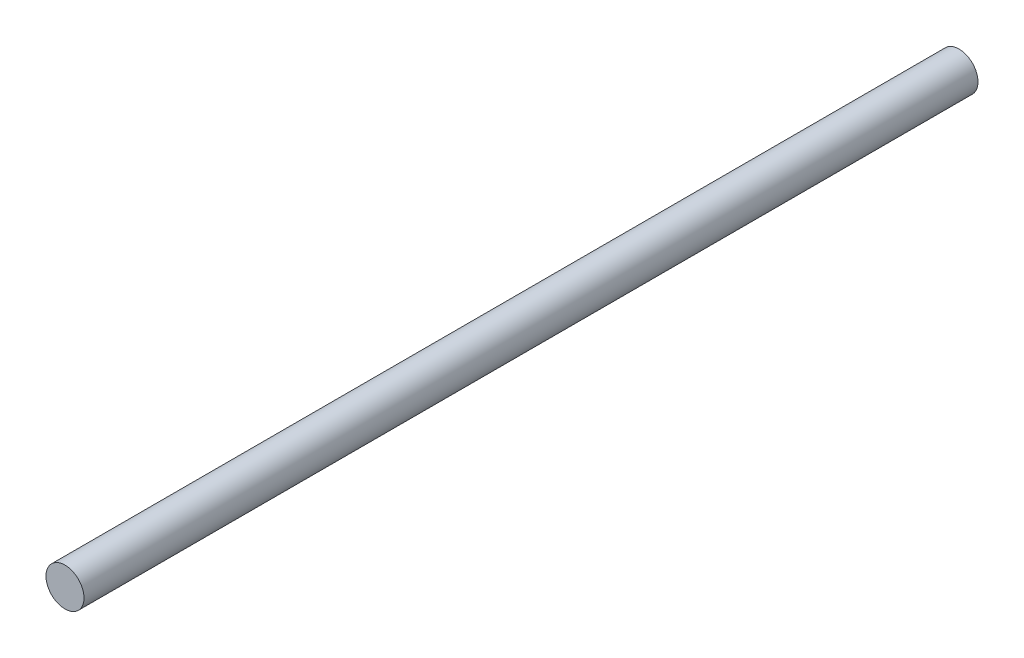
ISO-10303-21;
HEADER;
FILE_DESCRIPTION(('STEP AP214'),'2;1');
FILE_NAME('part.step','',(''),(''),'','','');
FILE_SCHEMA(('AUTOMOTIVE_DESIGN { 1 0 10303 214 1 1 1 1 }'));
ENDSEC;
DATA;
#1=APPLICATION_CONTEXT('core data for automotive mechanical design processes');
#2=APPLICATION_PROTOCOL_DEFINITION('international standard','automotive_design',2000,#1);
#3=PRODUCT_CONTEXT('',#1,'mechanical');
#4=PRODUCT('Part','Part','',(#3));
#5=PRODUCT_RELATED_PRODUCT_CATEGORY('part','',(#4));
#6=PRODUCT_DEFINITION_FORMATION('','',#4);
#7=PRODUCT_DEFINITION_CONTEXT('part definition',#1,'design');
#8=PRODUCT_DEFINITION('design','',#6,#7);
#9=PRODUCT_DEFINITION_SHAPE('','',#8);
#10=(LENGTH_UNIT() NAMED_UNIT(*) SI_UNIT(.MILLI.,.METRE.));
#11=(NAMED_UNIT(*) PLANE_ANGLE_UNIT() SI_UNIT($,.RADIAN.));
#12=(NAMED_UNIT(*) SI_UNIT($,.STERADIAN.) SOLID_ANGLE_UNIT());
#13=UNCERTAINTY_MEASURE_WITH_UNIT(LENGTH_MEASURE(1.E-05),#10,'distance_accuracy_value','');
#14=(GEOMETRIC_REPRESENTATION_CONTEXT(3) GLOBAL_UNCERTAINTY_ASSIGNED_CONTEXT((#13)) GLOBAL_UNIT_ASSIGNED_CONTEXT((#10,
#11,#12)) REPRESENTATION_CONTEXT('',''));
#15=CARTESIAN_POINT('',(0.,0.,0.));
#16=DIRECTION('',(0.,0.,1.));
#17=DIRECTION('',(1.,0.,0.));
#18=AXIS2_PLACEMENT_3D('',#15,#16,#17);
#19=CARTESIAN_POINT('',(0.,0.,25.));
#20=DIRECTION('',(0.,0.,-1.));
#21=DIRECTION('',(-1.,0.,0.));
#22=AXIS2_PLACEMENT_3D('',#19,#20,#21);
#23=CYLINDRICAL_SURFACE('',#22,1.);
#24=CARTESIAN_POINT('',(0.,0.,25.));
#25=DIRECTION('',(0.,0.,1.));
#26=DIRECTION('',(1.,0.,0.));
#27=AXIS2_PLACEMENT_3D('',#24,#25,#26);
#28=CIRCLE('',#27,1.);
#29=CARTESIAN_POINT('',(1.,0.,25.));
#30=VERTEX_POINT('',#29);
#31=EDGE_CURVE('E10',#30,#30,#28,.T.);
#32=ORIENTED_EDGE('',*,*,#31,.F.);
#33=EDGE_LOOP('',(#32));
#34=FACE_BOUND('',#33,.T.);
#35=CARTESIAN_POINT('',(0.,0.,-22.));
#36=DIRECTION('',(0.,0.,1.));
#37=DIRECTION('',(1.,0.,0.));
#38=AXIS2_PLACEMENT_3D('',#35,#36,#37);
#39=CIRCLE('',#38,1.);
#40=CARTESIAN_POINT('',(1.,0.,-22.));
#41=VERTEX_POINT('',#40);
#42=EDGE_CURVE('E43',#41,#41,#39,.T.);
#43=ORIENTED_EDGE('',*,*,#42,.T.);
#44=EDGE_LOOP('',(#43));
#45=FACE_BOUND('',#44,.T.);
#46=ADVANCED_FACE('F37',(#34,#45),#23,.T.);
#47=CARTESIAN_POINT('',(0.,0.,25.));
#48=DIRECTION('',(0.,0.,1.));
#49=DIRECTION('',(1.,0.,0.));
#50=AXIS2_PLACEMENT_3D('',#47,#48,#49);
#51=PLANE('',#50);
#52=ORIENTED_EDGE('',*,*,#31,.T.);
#53=EDGE_LOOP('',(#52));
#54=FACE_BOUND('',#53,.T.);
#55=ADVANCED_FACE('F52',(#54),#51,.T.);
#56=CARTESIAN_POINT('',(0.,0.,-22.));
#57=DIRECTION('',(0.,0.,1.));
#58=DIRECTION('',(1.,0.,0.));
#59=AXIS2_PLACEMENT_3D('',#56,#57,#58);
#60=PLANE('',#59);
#61=ORIENTED_EDGE('',*,*,#42,.F.);
#62=EDGE_LOOP('',(#61));
#63=FACE_BOUND('',#62,.T.);
#64=ADVANCED_FACE('F50',(#63),#60,.F.);
#65=CLOSED_SHELL('',(#46,#55,#64));
#66=MANIFOLD_SOLID_BREP('B2',#65);
#67=ADVANCED_BREP_SHAPE_REPRESENTATION('',(#18,#66),#14);
#68=SHAPE_DEFINITION_REPRESENTATION(#9,#67);
ENDSEC;
END-ISO-10303-21;
